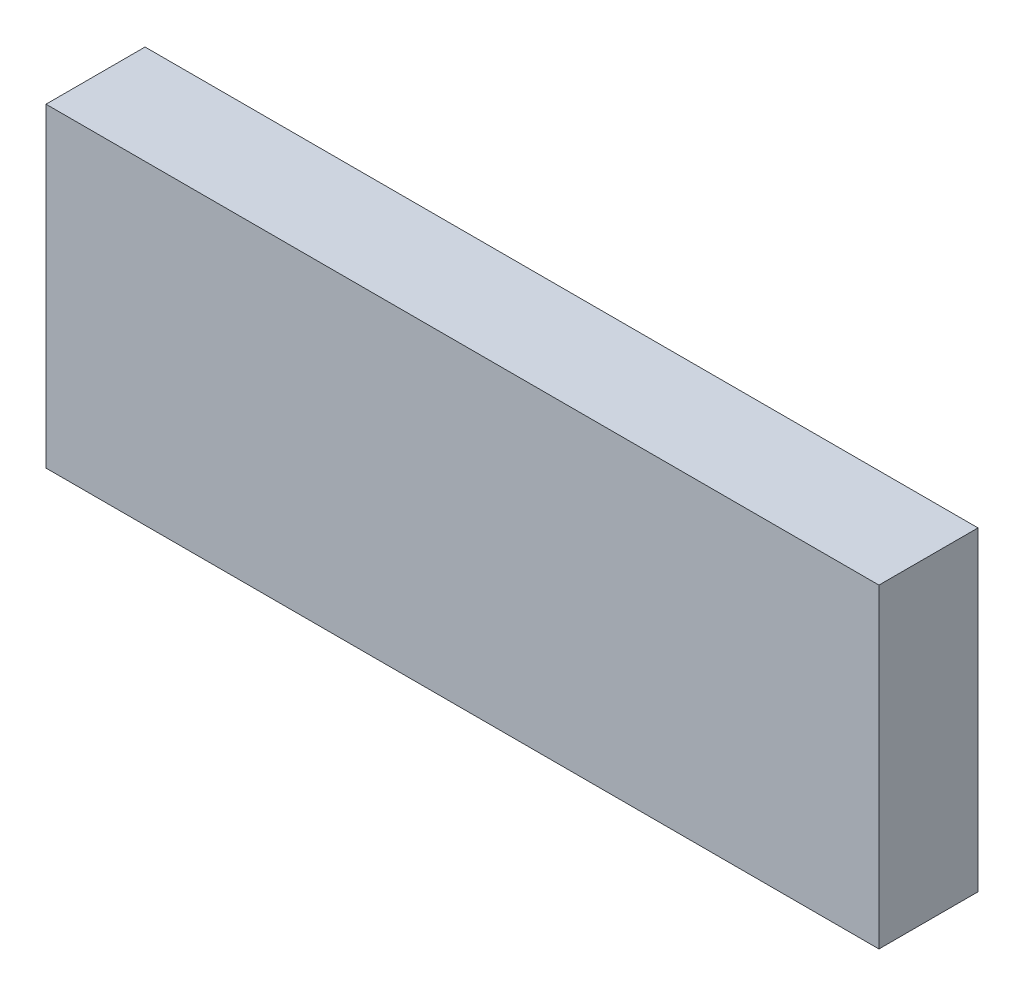
ISO-10303-21;
HEADER;
FILE_DESCRIPTION(('STEP AP214'),'2;1');
FILE_NAME('part.step','',(''),(''),'','','');
FILE_SCHEMA(('AUTOMOTIVE_DESIGN { 1 0 10303 214 1 1 1 1 }'));
ENDSEC;
DATA;
#1=APPLICATION_CONTEXT('core data for automotive mechanical design processes');
#2=APPLICATION_PROTOCOL_DEFINITION('international standard','automotive_design',2000,#1);
#3=PRODUCT_CONTEXT('',#1,'mechanical');
#4=PRODUCT('Part','Part','',(#3));
#5=PRODUCT_RELATED_PRODUCT_CATEGORY('part','',(#4));
#6=PRODUCT_DEFINITION_FORMATION('','',#4);
#7=PRODUCT_DEFINITION_CONTEXT('part definition',#1,'design');
#8=PRODUCT_DEFINITION('design','',#6,#7);
#9=PRODUCT_DEFINITION_SHAPE('','',#8);
#10=(LENGTH_UNIT() NAMED_UNIT(*) SI_UNIT(.MILLI.,.METRE.));
#11=(NAMED_UNIT(*) PLANE_ANGLE_UNIT() SI_UNIT($,.RADIAN.));
#12=(NAMED_UNIT(*) SI_UNIT($,.STERADIAN.) SOLID_ANGLE_UNIT());
#13=UNCERTAINTY_MEASURE_WITH_UNIT(LENGTH_MEASURE(1.E-05),#10,'distance_accuracy_value','');
#14=(GEOMETRIC_REPRESENTATION_CONTEXT(3) GLOBAL_UNCERTAINTY_ASSIGNED_CONTEXT((#13)) GLOBAL_UNIT_ASSIGNED_CONTEXT((#10,
#11,#12)) REPRESENTATION_CONTEXT('',''));
#15=CARTESIAN_POINT('',(0.,0.,0.));
#16=DIRECTION('',(0.,0.,1.));
#17=DIRECTION('',(1.,0.,0.));
#18=AXIS2_PLACEMENT_3D('',#15,#16,#17);
#19=CARTESIAN_POINT('',(92.5,70.,11.));
#20=DIRECTION('',(-1.,0.,0.));
#21=DIRECTION('',(0.,0.,1.));
#22=AXIS2_PLACEMENT_3D('',#19,#20,#21);
#23=PLANE('',#22);
#24=DIRECTION('',(0.,0.,-1.));
#25=VECTOR('',#24,1.);
#26=CARTESIAN_POINT('',(92.5,0.,11.));
#27=LINE('',#26,#25);
#28=CARTESIAN_POINT('',(92.5,0.,11.));
#29=VERTEX_POINT('',#28);
#30=CARTESIAN_POINT('',(92.5,0.,-11.));
#31=VERTEX_POINT('',#30);
#32=EDGE_CURVE('E96',#29,#31,#27,.T.);
#33=ORIENTED_EDGE('',*,*,#32,.T.);
#34=DIRECTION('',(0.,-1.,0.));
#35=VECTOR('',#34,1.);
#36=CARTESIAN_POINT('',(92.5,70.,-11.));
#37=LINE('',#36,#35);
#38=CARTESIAN_POINT('',(92.5,70.,-11.));
#39=VERTEX_POINT('',#38);
#40=EDGE_CURVE('E11',#39,#31,#37,.T.);
#41=ORIENTED_EDGE('',*,*,#40,.F.);
#42=DIRECTION('',(0.,0.,-1.));
#43=VECTOR('',#42,1.);
#44=CARTESIAN_POINT('',(92.5,70.,11.));
#45=LINE('',#44,#43);
#46=CARTESIAN_POINT('',(92.5,70.,11.));
#47=VERTEX_POINT('',#46);
#48=EDGE_CURVE('E84',#47,#39,#45,.T.);
#49=ORIENTED_EDGE('',*,*,#48,.F.);
#50=DIRECTION('',(0.,-1.,0.));
#51=VECTOR('',#50,1.);
#52=CARTESIAN_POINT('',(92.5,70.,11.));
#53=LINE('',#52,#51);
#54=EDGE_CURVE('E92',#47,#29,#53,.T.);
#55=ORIENTED_EDGE('',*,*,#54,.T.);
#56=EDGE_LOOP('',(#33,#41,#49,#55));
#57=FACE_BOUND('',#56,.T.);
#58=ADVANCED_FACE('F33',(#57),#23,.F.);
#59=CARTESIAN_POINT('',(-92.5,70.,-11.));
#60=DIRECTION('',(0.,0.,1.));
#61=DIRECTION('',(1.,0.,0.));
#62=AXIS2_PLACEMENT_3D('',#59,#60,#61);
#63=PLANE('',#62);
#64=DIRECTION('',(-1.,0.,0.));
#65=VECTOR('',#64,1.);
#66=CARTESIAN_POINT('',(-92.5,0.,-11.));
#67=LINE('',#66,#65);
#68=CARTESIAN_POINT('',(-92.5,0.,-11.));
#69=VERTEX_POINT('',#68);
#70=EDGE_CURVE('E88',#31,#69,#67,.T.);
#71=ORIENTED_EDGE('',*,*,#70,.T.);
#72=DIRECTION('',(0.,-1.,0.));
#73=VECTOR('',#72,1.);
#74=CARTESIAN_POINT('',(-92.5,70.,-11.));
#75=LINE('',#74,#73);
#76=CARTESIAN_POINT('',(-92.5,70.,-11.));
#77=VERTEX_POINT('',#76);
#78=EDGE_CURVE('E41',#77,#69,#75,.T.);
#79=ORIENTED_EDGE('',*,*,#78,.F.);
#80=DIRECTION('',(-1.,0.,0.));
#81=VECTOR('',#80,1.);
#82=CARTESIAN_POINT('',(-92.5,70.,-11.));
#83=LINE('',#82,#81);
#84=EDGE_CURVE('E79',#39,#77,#83,.T.);
#85=ORIENTED_EDGE('',*,*,#84,.F.);
#86=ORIENTED_EDGE('',*,*,#40,.T.);
#87=EDGE_LOOP('',(#71,#79,#85,#86));
#88=FACE_BOUND('',#87,.T.);
#89=ADVANCED_FACE('F87',(#88),#63,.F.);
#90=CARTESIAN_POINT('',(-92.5,70.,11.));
#91=DIRECTION('',(1.,0.,0.));
#92=DIRECTION('',(0.,0.,-1.));
#93=AXIS2_PLACEMENT_3D('',#90,#91,#92);
#94=PLANE('',#93);
#95=DIRECTION('',(0.,0.,1.));
#96=VECTOR('',#95,1.);
#97=CARTESIAN_POINT('',(-92.5,0.,11.));
#98=LINE('',#97,#96);
#99=CARTESIAN_POINT('',(-92.5,0.,11.));
#100=VERTEX_POINT('',#99);
#101=EDGE_CURVE('E66',#69,#100,#98,.T.);
#102=ORIENTED_EDGE('',*,*,#101,.T.);
#103=DIRECTION('',(0.,-1.,0.));
#104=VECTOR('',#103,1.);
#105=CARTESIAN_POINT('',(-92.5,70.,11.));
#106=LINE('',#105,#104);
#107=CARTESIAN_POINT('',(-92.5,70.,11.));
#108=VERTEX_POINT('',#107);
#109=EDGE_CURVE('E89',#108,#100,#106,.T.);
#110=ORIENTED_EDGE('',*,*,#109,.F.);
#111=DIRECTION('',(0.,0.,1.));
#112=VECTOR('',#111,1.);
#113=CARTESIAN_POINT('',(-92.5,70.,11.));
#114=LINE('',#113,#112);
#115=EDGE_CURVE('E82',#77,#108,#114,.T.);
#116=ORIENTED_EDGE('',*,*,#115,.F.);
#117=ORIENTED_EDGE('',*,*,#78,.T.);
#118=EDGE_LOOP('',(#102,#110,#116,#117));
#119=FACE_BOUND('',#118,.T.);
#120=ADVANCED_FACE('F90',(#119),#94,.F.);
#121=CARTESIAN_POINT('',(-92.5,70.,11.));
#122=DIRECTION('',(0.,0.,-1.));
#123=DIRECTION('',(-1.,0.,0.));
#124=AXIS2_PLACEMENT_3D('',#121,#122,#123);
#125=PLANE('',#124);
#126=DIRECTION('',(1.,0.,0.));
#127=VECTOR('',#126,1.);
#128=CARTESIAN_POINT('',(-92.5,0.,11.));
#129=LINE('',#128,#127);
#130=EDGE_CURVE('E72',#100,#29,#129,.T.);
#131=ORIENTED_EDGE('',*,*,#130,.T.);
#132=ORIENTED_EDGE('',*,*,#54,.F.);
#133=DIRECTION('',(1.,0.,0.));
#134=VECTOR('',#133,1.);
#135=CARTESIAN_POINT('',(-92.5,70.,11.));
#136=LINE('',#135,#134);
#137=EDGE_CURVE('E49',#108,#47,#136,.T.);
#138=ORIENTED_EDGE('',*,*,#137,.F.);
#139=ORIENTED_EDGE('',*,*,#109,.T.);
#140=EDGE_LOOP('',(#131,#132,#138,#139));
#141=FACE_BOUND('',#140,.T.);
#142=ADVANCED_FACE('F103',(#141),#125,.F.);
#143=CARTESIAN_POINT('',(0.,70.,0.));
#144=DIRECTION('',(0.,-1.,0.));
#145=DIRECTION('',(0.,0.,-1.));
#146=AXIS2_PLACEMENT_3D('',#143,#144,#145);
#147=PLANE('',#146);
#148=ORIENTED_EDGE('',*,*,#48,.T.);
#149=ORIENTED_EDGE('',*,*,#84,.T.);
#150=ORIENTED_EDGE('',*,*,#115,.T.);
#151=ORIENTED_EDGE('',*,*,#137,.T.);
#152=EDGE_LOOP('',(#148,#149,#150,#151));
#153=FACE_BOUND('',#152,.T.);
#154=ADVANCED_FACE('F80',(#153),#147,.F.);
#155=CARTESIAN_POINT('',(0.,0.,0.));
#156=DIRECTION('',(0.,-1.,0.));
#157=DIRECTION('',(0.,0.,-1.));
#158=AXIS2_PLACEMENT_3D('',#155,#156,#157);
#159=PLANE('',#158);
#160=ORIENTED_EDGE('',*,*,#32,.F.);
#161=ORIENTED_EDGE('',*,*,#130,.F.);
#162=ORIENTED_EDGE('',*,*,#101,.F.);
#163=ORIENTED_EDGE('',*,*,#70,.F.);
#164=EDGE_LOOP('',(#160,#161,#162,#163));
#165=FACE_BOUND('',#164,.T.);
#166=ADVANCED_FACE('F106',(#165),#159,.T.);
#167=CLOSED_SHELL('',(#58,#89,#120,#142,#154,#166));
#168=MANIFOLD_SOLID_BREP('B2',#167);
#169=ADVANCED_BREP_SHAPE_REPRESENTATION('',(#18,#168),#14);
#170=SHAPE_DEFINITION_REPRESENTATION(#9,#169);
ENDSEC;
END-ISO-10303-21;
